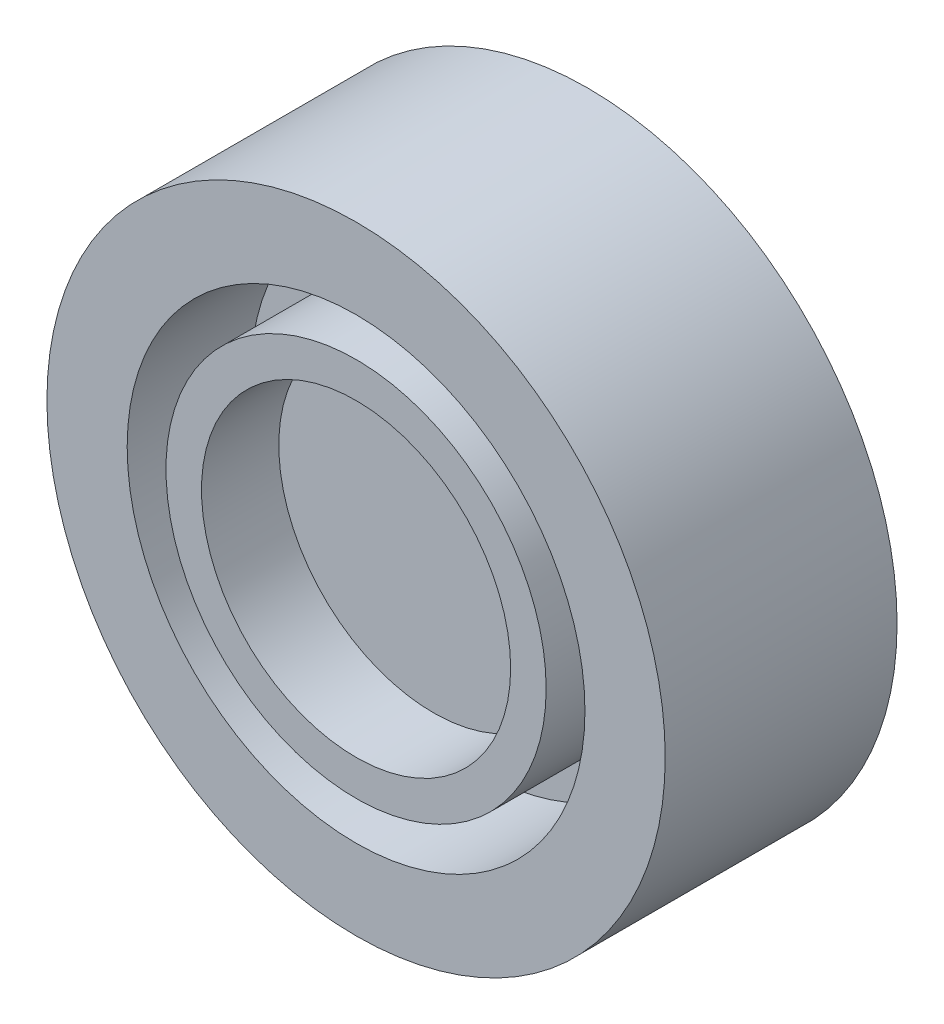
ISO-10303-21;
HEADER;
FILE_DESCRIPTION(('STEP AP214'),'2;1');
FILE_NAME('part.step','',(''),(''),'','','');
FILE_SCHEMA(('AUTOMOTIVE_DESIGN { 1 0 10303 214 1 1 1 1 }'));
ENDSEC;
DATA;
#1=APPLICATION_CONTEXT('core data for automotive mechanical design processes');
#2=APPLICATION_PROTOCOL_DEFINITION('international standard','automotive_design',2000,#1);
#3=PRODUCT_CONTEXT('',#1,'mechanical');
#4=PRODUCT('Part','Part','',(#3));
#5=PRODUCT_RELATED_PRODUCT_CATEGORY('part','',(#4));
#6=PRODUCT_DEFINITION_FORMATION('','',#4);
#7=PRODUCT_DEFINITION_CONTEXT('part definition',#1,'design');
#8=PRODUCT_DEFINITION('design','',#6,#7);
#9=PRODUCT_DEFINITION_SHAPE('','',#8);
#10=(LENGTH_UNIT() NAMED_UNIT(*) SI_UNIT(.MILLI.,.METRE.));
#11=(NAMED_UNIT(*) PLANE_ANGLE_UNIT() SI_UNIT($,.RADIAN.));
#12=(NAMED_UNIT(*) SI_UNIT($,.STERADIAN.) SOLID_ANGLE_UNIT());
#13=UNCERTAINTY_MEASURE_WITH_UNIT(LENGTH_MEASURE(1.E-05),#10,'distance_accuracy_value','');
#14=(GEOMETRIC_REPRESENTATION_CONTEXT(3) GLOBAL_UNCERTAINTY_ASSIGNED_CONTEXT((#13)) GLOBAL_UNIT_ASSIGNED_CONTEXT((#10,
#11,#12)) REPRESENTATION_CONTEXT('',''));
#15=CARTESIAN_POINT('',(0.,0.,0.));
#16=DIRECTION('',(0.,0.,1.));
#17=DIRECTION('',(1.,0.,0.));
#18=AXIS2_PLACEMENT_3D('',#15,#16,#17);
#19=CARTESIAN_POINT('',(0.,0.,15.));
#20=DIRECTION('',(0.,0.,-1.));
#21=DIRECTION('',(-1.,0.,0.));
#22=AXIS2_PLACEMENT_3D('',#19,#20,#21);
#23=CYLINDRICAL_SURFACE('',#22,20.);
#24=CARTESIAN_POINT('',(0.,0.,15.));
#25=DIRECTION('',(0.,0.,1.));
#26=DIRECTION('',(1.,0.,0.));
#27=AXIS2_PLACEMENT_3D('',#24,#25,#26);
#28=CIRCLE('',#27,20.);
#29=CARTESIAN_POINT('',(20.,0.,15.));
#30=VERTEX_POINT('',#29);
#31=EDGE_CURVE('E10',#30,#30,#28,.T.);
#32=ORIENTED_EDGE('',*,*,#31,.F.);
#33=EDGE_LOOP('',(#32));
#34=FACE_BOUND('',#33,.T.);
#35=CARTESIAN_POINT('',(0.,0.,0.));
#36=DIRECTION('',(0.,0.,1.));
#37=DIRECTION('',(1.,0.,0.));
#38=AXIS2_PLACEMENT_3D('',#35,#36,#37);
#39=CIRCLE('',#38,20.);
#40=CARTESIAN_POINT('',(20.,0.,0.));
#41=VERTEX_POINT('',#40);
#42=EDGE_CURVE('E34',#41,#41,#39,.T.);
#43=ORIENTED_EDGE('',*,*,#42,.T.);
#44=EDGE_LOOP('',(#43));
#45=FACE_BOUND('',#44,.T.);
#46=ADVANCED_FACE('F31',(#34,#45),#23,.T.);
#47=CARTESIAN_POINT('',(0.,0.,15.));
#48=DIRECTION('',(0.,0.,1.));
#49=DIRECTION('',(1.,0.,0.));
#50=AXIS2_PLACEMENT_3D('',#47,#48,#49);
#51=PLANE('',#50);
#52=CARTESIAN_POINT('',(0.,0.,15.));
#53=DIRECTION('',(0.,0.,1.));
#54=DIRECTION('',(1.,0.,0.));
#55=AXIS2_PLACEMENT_3D('',#52,#53,#54);
#56=CIRCLE('',#55,14.807877090399);
#57=CARTESIAN_POINT('',(14.807877090399,0.,15.));
#58=VERTEX_POINT('',#57);
#59=EDGE_CURVE('E49',#58,#58,#56,.T.);
#60=ORIENTED_EDGE('',*,*,#59,.F.);
#61=EDGE_LOOP('',(#60));
#62=FACE_BOUND('',#61,.T.);
#63=ORIENTED_EDGE('',*,*,#31,.T.);
#64=EDGE_LOOP('',(#63));
#65=FACE_BOUND('',#64,.T.);
#66=ADVANCED_FACE('F77',(#62,#65),#51,.T.);
#67=CARTESIAN_POINT('',(0.,0.,0.));
#68=DIRECTION('',(0.,0.,1.));
#69=DIRECTION('',(1.,0.,0.));
#70=AXIS2_PLACEMENT_3D('',#67,#68,#69);
#71=PLANE('',#70);
#72=ORIENTED_EDGE('',*,*,#42,.F.);
#73=EDGE_LOOP('',(#72));
#74=FACE_BOUND('',#73,.T.);
#75=ADVANCED_FACE('F73',(#74),#71,.F.);
#76=CARTESIAN_POINT('',(0.,0.,7.));
#77=DIRECTION('',(0.,0.,1.));
#78=DIRECTION('',(1.,0.,0.));
#79=AXIS2_PLACEMENT_3D('',#76,#77,#78);
#80=CYLINDRICAL_SURFACE('',#79,14.807877090399);
#81=CARTESIAN_POINT('',(0.,0.,7.));
#82=DIRECTION('',(0.,0.,1.));
#83=DIRECTION('',(1.,0.,0.));
#84=AXIS2_PLACEMENT_3D('',#81,#82,#83);
#85=CIRCLE('',#84,14.807877090399);
#86=CARTESIAN_POINT('',(14.807877090399,0.,7.));
#87=VERTEX_POINT('',#86);
#88=EDGE_CURVE('E46',#87,#87,#85,.T.);
#89=ORIENTED_EDGE('',*,*,#88,.F.);
#90=EDGE_LOOP('',(#89));
#91=FACE_BOUND('',#90,.T.);
#92=ORIENTED_EDGE('',*,*,#59,.T.);
#93=EDGE_LOOP('',(#92));
#94=FACE_BOUND('',#93,.T.);
#95=ADVANCED_FACE('F67',(#91,#94),#80,.F.);
#96=CARTESIAN_POINT('',(0.,0.,7.));
#97=DIRECTION('',(0.,0.,1.));
#98=DIRECTION('',(1.,0.,0.));
#99=AXIS2_PLACEMENT_3D('',#96,#97,#98);
#100=PLANE('',#99);
#101=CARTESIAN_POINT('',(0.,0.,7.));
#102=DIRECTION('',(0.,0.,1.));
#103=DIRECTION('',(1.,0.,0.));
#104=AXIS2_PLACEMENT_3D('',#101,#102,#103);
#105=CIRCLE('',#104,12.2981698379867);
#106=CARTESIAN_POINT('',(12.2981698379867,0.,7.));
#107=VERTEX_POINT('',#106);
#108=EDGE_CURVE('E52',#107,#107,#105,.T.);
#109=ORIENTED_EDGE('',*,*,#108,.F.);
#110=EDGE_LOOP('',(#109));
#111=FACE_BOUND('',#110,.T.);
#112=ORIENTED_EDGE('',*,*,#88,.T.);
#113=EDGE_LOOP('',(#112));
#114=FACE_BOUND('',#113,.T.);
#115=ADVANCED_FACE('F64',(#111,#114),#100,.T.);
#116=CARTESIAN_POINT('',(0.,0.,7.));
#117=DIRECTION('',(0.,0.,1.));
#118=DIRECTION('',(1.,0.,0.));
#119=AXIS2_PLACEMENT_3D('',#116,#117,#118);
#120=CYLINDRICAL_SURFACE('',#119,12.2981698379867);
#121=ORIENTED_EDGE('',*,*,#108,.T.);
#122=EDGE_LOOP('',(#121));
#123=FACE_BOUND('',#122,.T.);
#124=CARTESIAN_POINT('',(0.,0.,15.));
#125=DIRECTION('',(0.,0.,1.));
#126=DIRECTION('',(1.,0.,0.));
#127=AXIS2_PLACEMENT_3D('',#124,#125,#126);
#128=CIRCLE('',#127,12.2981698379867);
#129=CARTESIAN_POINT('',(12.2981698379867,0.,15.));
#130=VERTEX_POINT('',#129);
#131=EDGE_CURVE('E55',#130,#130,#128,.T.);
#132=ORIENTED_EDGE('',*,*,#131,.F.);
#133=EDGE_LOOP('',(#132));
#134=FACE_BOUND('',#133,.T.);
#135=ADVANCED_FACE('F61',(#123,#134),#120,.T.);
#136=CARTESIAN_POINT('',(0.,0.,10.));
#137=DIRECTION('',(0.,0.,1.));
#138=DIRECTION('',(1.,0.,0.));
#139=AXIS2_PLACEMENT_3D('',#136,#137,#138);
#140=PLANE('',#139);
#141=CARTESIAN_POINT('',(0.,0.,10.));
#142=DIRECTION('',(0.,0.,1.));
#143=DIRECTION('',(1.,0.,0.));
#144=AXIS2_PLACEMENT_3D('',#141,#142,#143);
#145=CIRCLE('',#144,10.);
#146=CARTESIAN_POINT('',(10.,0.,10.));
#147=VERTEX_POINT('',#146);
#148=EDGE_CURVE('E41',#147,#147,#145,.T.);
#149=ORIENTED_EDGE('',*,*,#148,.T.);
#150=EDGE_LOOP('',(#149));
#151=FACE_BOUND('',#150,.T.);
#152=ADVANCED_FACE('F94',(#151),#140,.T.);
#153=CARTESIAN_POINT('',(0.,0.,10.));
#154=DIRECTION('',(0.,0.,1.));
#155=DIRECTION('',(1.,0.,0.));
#156=AXIS2_PLACEMENT_3D('',#153,#154,#155);
#157=CYLINDRICAL_SURFACE('',#156,10.);
#158=ORIENTED_EDGE('',*,*,#148,.F.);
#159=EDGE_LOOP('',(#158));
#160=FACE_BOUND('',#159,.T.);
#161=CARTESIAN_POINT('',(0.,0.,15.));
#162=DIRECTION('',(0.,0.,1.));
#163=DIRECTION('',(1.,0.,0.));
#164=AXIS2_PLACEMENT_3D('',#161,#162,#163);
#165=CIRCLE('',#164,10.);
#166=CARTESIAN_POINT('',(10.,0.,15.));
#167=VERTEX_POINT('',#166);
#168=EDGE_CURVE('E43',#167,#167,#165,.T.);
#169=ORIENTED_EDGE('',*,*,#168,.T.);
#170=EDGE_LOOP('',(#169));
#171=FACE_BOUND('',#170,.T.);
#172=ADVANCED_FACE('F89',(#160,#171),#157,.F.);
#173=ORIENTED_EDGE('',*,*,#168,.F.);
#174=EDGE_LOOP('',(#173));
#175=FACE_BOUND('',#174,.T.);
#176=ORIENTED_EDGE('',*,*,#131,.T.);
#177=EDGE_LOOP('',(#176));
#178=FACE_BOUND('',#177,.T.);
#179=ADVANCED_FACE('F80',(#175,#178),#51,.T.);
#180=CLOSED_SHELL('',(#46,#66,#75,#95,#115,#135,#152,#172,#179));
#181=MANIFOLD_SOLID_BREP('B2',#180);
#182=ADVANCED_BREP_SHAPE_REPRESENTATION('',(#18,#181),#14);
#183=SHAPE_DEFINITION_REPRESENTATION(#9,#182);
ENDSEC;
END-ISO-10303-21;
